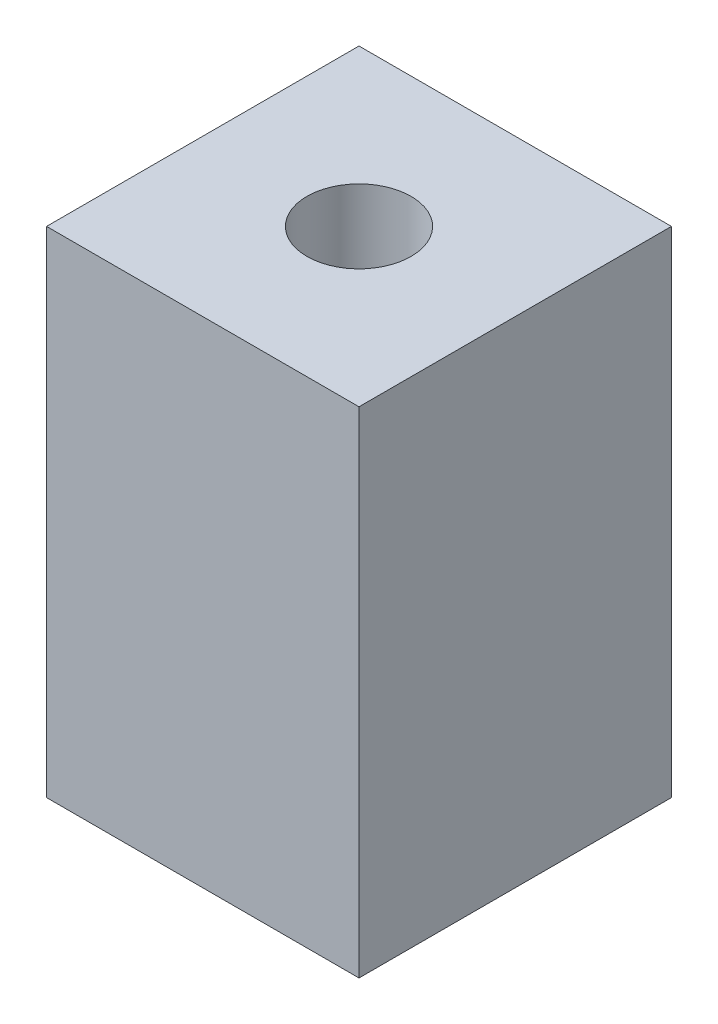
ISO-10303-21;
HEADER;
FILE_DESCRIPTION(('STEP AP214'),'2;1');
FILE_NAME('part.step','',(''),(''),'','','');
FILE_SCHEMA(('AUTOMOTIVE_DESIGN { 1 0 10303 214 1 1 1 1 }'));
ENDSEC;
DATA;
#1=APPLICATION_CONTEXT('core data for automotive mechanical design processes');
#2=APPLICATION_PROTOCOL_DEFINITION('international standard','automotive_design',2000,#1);
#3=PRODUCT_CONTEXT('',#1,'mechanical');
#4=PRODUCT('Part','Part','',(#3));
#5=PRODUCT_RELATED_PRODUCT_CATEGORY('part','',(#4));
#6=PRODUCT_DEFINITION_FORMATION('','',#4);
#7=PRODUCT_DEFINITION_CONTEXT('part definition',#1,'design');
#8=PRODUCT_DEFINITION('design','',#6,#7);
#9=PRODUCT_DEFINITION_SHAPE('','',#8);
#10=(LENGTH_UNIT() NAMED_UNIT(*) SI_UNIT(.MILLI.,.METRE.));
#11=(NAMED_UNIT(*) PLANE_ANGLE_UNIT() SI_UNIT($,.RADIAN.));
#12=(NAMED_UNIT(*) SI_UNIT($,.STERADIAN.) SOLID_ANGLE_UNIT());
#13=UNCERTAINTY_MEASURE_WITH_UNIT(LENGTH_MEASURE(1.E-05),#10,'distance_accuracy_value','');
#14=(GEOMETRIC_REPRESENTATION_CONTEXT(3) GLOBAL_UNCERTAINTY_ASSIGNED_CONTEXT((#13)) GLOBAL_UNIT_ASSIGNED_CONTEXT((#10,
#11,#12)) REPRESENTATION_CONTEXT('',''));
#15=CARTESIAN_POINT('',(0.,0.,0.));
#16=DIRECTION('',(0.,0.,1.));
#17=DIRECTION('',(1.,0.,0.));
#18=AXIS2_PLACEMENT_3D('',#15,#16,#17);
#19=CARTESIAN_POINT('',(0.,19.,0.));
#20=DIRECTION('',(0.,1.,0.));
#21=DIRECTION('',(0.,0.,1.));
#22=AXIS2_PLACEMENT_3D('',#19,#20,#21);
#23=PLANE('',#22);
#24=DIRECTION('',(0.,0.,-1.));
#25=VECTOR('',#24,1.);
#26=CARTESIAN_POINT('',(6.,19.,-6.));
#27=LINE('',#26,#25);
#28=CARTESIAN_POINT('',(6.,19.,6.));
#29=VERTEX_POINT('',#28);
#30=CARTESIAN_POINT('',(6.,19.,-6.));
#31=VERTEX_POINT('',#30);
#32=EDGE_CURVE('E84',#29,#31,#27,.T.);
#33=ORIENTED_EDGE('',*,*,#32,.T.);
#34=DIRECTION('',(-1.,0.,0.));
#35=VECTOR('',#34,1.);
#36=CARTESIAN_POINT('',(-6.,19.,-6.));
#37=LINE('',#36,#35);
#38=CARTESIAN_POINT('',(-6.,19.,-6.));
#39=VERTEX_POINT('',#38);
#40=EDGE_CURVE('E79',#31,#39,#37,.T.);
#41=ORIENTED_EDGE('',*,*,#40,.T.);
#42=DIRECTION('',(0.,0.,1.));
#43=VECTOR('',#42,1.);
#44=CARTESIAN_POINT('',(-6.,19.,-6.));
#45=LINE('',#44,#43);
#46=CARTESIAN_POINT('',(-6.,19.,6.));
#47=VERTEX_POINT('',#46);
#48=EDGE_CURVE('E82',#39,#47,#45,.T.);
#49=ORIENTED_EDGE('',*,*,#48,.T.);
#50=DIRECTION('',(1.,0.,0.));
#51=VECTOR('',#50,1.);
#52=CARTESIAN_POINT('',(-6.,19.,6.));
#53=LINE('',#52,#51);
#54=EDGE_CURVE('E49',#47,#29,#53,.T.);
#55=ORIENTED_EDGE('',*,*,#54,.T.);
#56=EDGE_LOOP('',(#33,#41,#49,#55));
#57=FACE_BOUND('',#56,.T.);
#58=CARTESIAN_POINT('',(0.,19.,0.));
#59=DIRECTION('',(0.,1.,0.));
#60=DIRECTION('',(0.,0.,1.));
#61=AXIS2_PLACEMENT_3D('',#58,#59,#60);
#62=CIRCLE('',#61,2.);
#63=CARTESIAN_POINT('',(0.,19.,2.));
#64=VERTEX_POINT('',#63);
#65=EDGE_CURVE('E99',#64,#64,#62,.T.);
#66=ORIENTED_EDGE('',*,*,#65,.F.);
#67=EDGE_LOOP('',(#66));
#68=FACE_BOUND('',#67,.T.);
#69=ADVANCED_FACE('F32',(#57,#68),#23,.T.);
#70=CARTESIAN_POINT('',(0.,0.,0.));
#71=DIRECTION('',(0.,1.,0.));
#72=DIRECTION('',(0.,0.,1.));
#73=AXIS2_PLACEMENT_3D('',#70,#71,#72);
#74=PLANE('',#73);
#75=DIRECTION('',(0.,0.,-1.));
#76=VECTOR('',#75,1.);
#77=CARTESIAN_POINT('',(6.,0.,-6.));
#78=LINE('',#77,#76);
#79=CARTESIAN_POINT('',(6.,0.,6.));
#80=VERTEX_POINT('',#79);
#81=CARTESIAN_POINT('',(6.,0.,-6.));
#82=VERTEX_POINT('',#81);
#83=EDGE_CURVE('E96',#80,#82,#78,.T.);
#84=ORIENTED_EDGE('',*,*,#83,.F.);
#85=DIRECTION('',(1.,0.,0.));
#86=VECTOR('',#85,1.);
#87=CARTESIAN_POINT('',(-6.,0.,6.));
#88=LINE('',#87,#86);
#89=CARTESIAN_POINT('',(-6.,0.,6.));
#90=VERTEX_POINT('',#89);
#91=EDGE_CURVE('E72',#90,#80,#88,.T.);
#92=ORIENTED_EDGE('',*,*,#91,.F.);
#93=DIRECTION('',(0.,0.,1.));
#94=VECTOR('',#93,1.);
#95=CARTESIAN_POINT('',(-6.,0.,-6.));
#96=LINE('',#95,#94);
#97=CARTESIAN_POINT('',(-6.,0.,-6.));
#98=VERTEX_POINT('',#97);
#99=EDGE_CURVE('E66',#98,#90,#96,.T.);
#100=ORIENTED_EDGE('',*,*,#99,.F.);
#101=DIRECTION('',(-1.,0.,0.));
#102=VECTOR('',#101,1.);
#103=CARTESIAN_POINT('',(-6.,0.,-6.));
#104=LINE('',#103,#102);
#105=EDGE_CURVE('E88',#82,#98,#104,.T.);
#106=ORIENTED_EDGE('',*,*,#105,.F.);
#107=EDGE_LOOP('',(#84,#92,#100,#106));
#108=FACE_BOUND('',#107,.T.);
#109=CARTESIAN_POINT('',(0.,0.,0.));
#110=DIRECTION('',(0.,1.,0.));
#111=DIRECTION('',(0.,0.,1.));
#112=AXIS2_PLACEMENT_3D('',#109,#110,#111);
#113=CIRCLE('',#112,2.);
#114=CARTESIAN_POINT('',(0.,0.,2.));
#115=VERTEX_POINT('',#114);
#116=EDGE_CURVE('E111',#115,#115,#113,.T.);
#117=ORIENTED_EDGE('',*,*,#116,.T.);
#118=EDGE_LOOP('',(#117));
#119=FACE_BOUND('',#118,.T.);
#120=ADVANCED_FACE('F107',(#108,#119),#74,.F.);
#121=CARTESIAN_POINT('',(6.,19.,-6.));
#122=DIRECTION('',(-1.,0.,0.));
#123=DIRECTION('',(0.,0.,1.));
#124=AXIS2_PLACEMENT_3D('',#121,#122,#123);
#125=PLANE('',#124);
#126=ORIENTED_EDGE('',*,*,#83,.T.);
#127=DIRECTION('',(0.,-1.,0.));
#128=VECTOR('',#127,1.);
#129=CARTESIAN_POINT('',(6.,19.,-6.));
#130=LINE('',#129,#128);
#131=EDGE_CURVE('E11',#31,#82,#130,.T.);
#132=ORIENTED_EDGE('',*,*,#131,.F.);
#133=ORIENTED_EDGE('',*,*,#32,.F.);
#134=DIRECTION('',(0.,-1.,0.));
#135=VECTOR('',#134,1.);
#136=CARTESIAN_POINT('',(6.,19.,6.));
#137=LINE('',#136,#135);
#138=EDGE_CURVE('E92',#29,#80,#137,.T.);
#139=ORIENTED_EDGE('',*,*,#138,.T.);
#140=EDGE_LOOP('',(#126,#132,#133,#139));
#141=FACE_BOUND('',#140,.T.);
#142=ADVANCED_FACE('F34',(#141),#125,.F.);
#143=CARTESIAN_POINT('',(-6.,19.,-6.));
#144=DIRECTION('',(0.,0.,1.));
#145=DIRECTION('',(1.,0.,0.));
#146=AXIS2_PLACEMENT_3D('',#143,#144,#145);
#147=PLANE('',#146);
#148=ORIENTED_EDGE('',*,*,#105,.T.);
#149=DIRECTION('',(0.,-1.,0.));
#150=VECTOR('',#149,1.);
#151=CARTESIAN_POINT('',(-6.,19.,-6.));
#152=LINE('',#151,#150);
#153=EDGE_CURVE('E41',#39,#98,#152,.T.);
#154=ORIENTED_EDGE('',*,*,#153,.F.);
#155=ORIENTED_EDGE('',*,*,#40,.F.);
#156=ORIENTED_EDGE('',*,*,#131,.T.);
#157=EDGE_LOOP('',(#148,#154,#155,#156));
#158=FACE_BOUND('',#157,.T.);
#159=ADVANCED_FACE('F87',(#158),#147,.F.);
#160=CARTESIAN_POINT('',(-6.,19.,-6.));
#161=DIRECTION('',(1.,0.,0.));
#162=DIRECTION('',(0.,0.,-1.));
#163=AXIS2_PLACEMENT_3D('',#160,#161,#162);
#164=PLANE('',#163);
#165=ORIENTED_EDGE('',*,*,#99,.T.);
#166=DIRECTION('',(0.,-1.,0.));
#167=VECTOR('',#166,1.);
#168=CARTESIAN_POINT('',(-6.,19.,6.));
#169=LINE('',#168,#167);
#170=EDGE_CURVE('E89',#47,#90,#169,.T.);
#171=ORIENTED_EDGE('',*,*,#170,.F.);
#172=ORIENTED_EDGE('',*,*,#48,.F.);
#173=ORIENTED_EDGE('',*,*,#153,.T.);
#174=EDGE_LOOP('',(#165,#171,#172,#173));
#175=FACE_BOUND('',#174,.T.);
#176=ADVANCED_FACE('F90',(#175),#164,.F.);
#177=CARTESIAN_POINT('',(-6.,19.,6.));
#178=DIRECTION('',(0.,0.,-1.));
#179=DIRECTION('',(-1.,0.,0.));
#180=AXIS2_PLACEMENT_3D('',#177,#178,#179);
#181=PLANE('',#180);
#182=ORIENTED_EDGE('',*,*,#91,.T.);
#183=ORIENTED_EDGE('',*,*,#138,.F.);
#184=ORIENTED_EDGE('',*,*,#54,.F.);
#185=ORIENTED_EDGE('',*,*,#170,.T.);
#186=EDGE_LOOP('',(#182,#183,#184,#185));
#187=FACE_BOUND('',#186,.T.);
#188=ADVANCED_FACE('F104',(#187),#181,.F.);
#189=CARTESIAN_POINT('',(0.,19.,0.));
#190=DIRECTION('',(0.,-1.,0.));
#191=DIRECTION('',(0.,0.,-1.));
#192=AXIS2_PLACEMENT_3D('',#189,#190,#191);
#193=CYLINDRICAL_SURFACE('',#192,2.);
#194=ORIENTED_EDGE('',*,*,#65,.T.);
#195=EDGE_LOOP('',(#194));
#196=FACE_BOUND('',#195,.T.);
#197=ORIENTED_EDGE('',*,*,#116,.F.);
#198=EDGE_LOOP('',(#197));
#199=FACE_BOUND('',#198,.T.);
#200=ADVANCED_FACE('F117',(#196,#199),#193,.F.);
#201=CLOSED_SHELL('',(#69,#120,#142,#159,#176,#188,#200));
#202=MANIFOLD_SOLID_BREP('B2',#201);
#203=ADVANCED_BREP_SHAPE_REPRESENTATION('',(#18,#202),#14);
#204=SHAPE_DEFINITION_REPRESENTATION(#9,#203);
ENDSEC;
END-ISO-10303-21;
